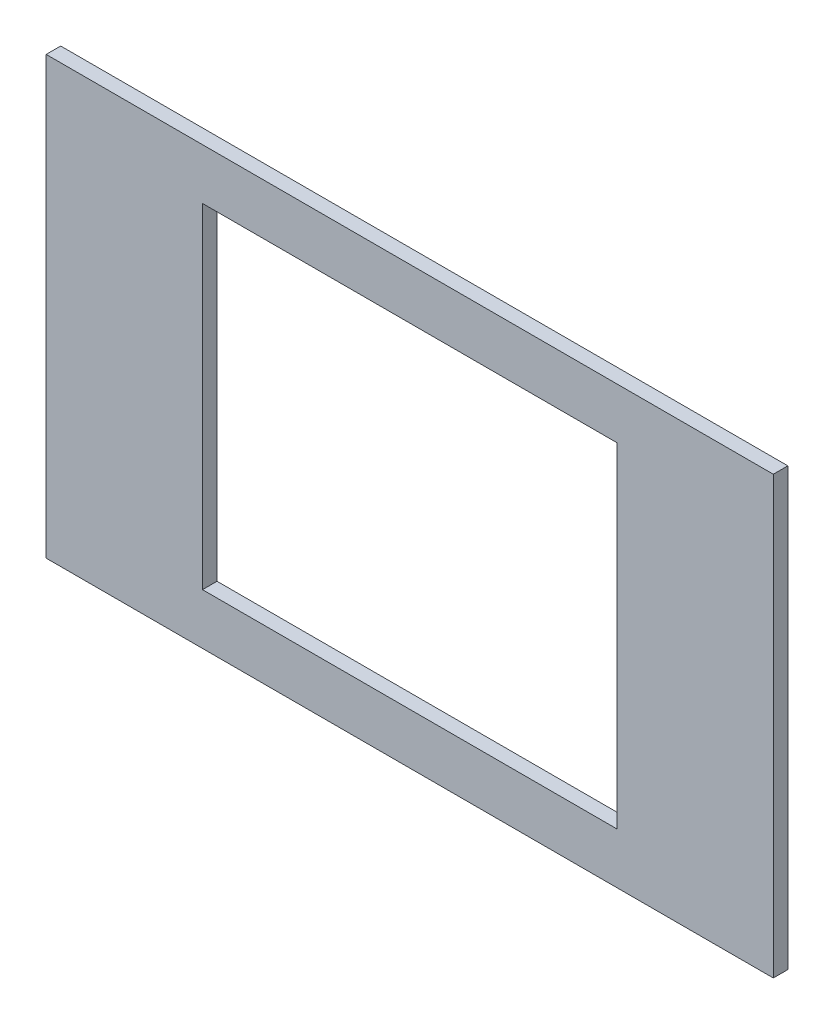
ISO-10303-21;
HEADER;
FILE_DESCRIPTION(('STEP AP214'),'2;1');
FILE_NAME('part.step','',(''),(''),'','','');
FILE_SCHEMA(('AUTOMOTIVE_DESIGN { 1 0 10303 214 1 1 1 1 }'));
ENDSEC;
DATA;
#1=APPLICATION_CONTEXT('core data for automotive mechanical design processes');
#2=APPLICATION_PROTOCOL_DEFINITION('international standard','automotive_design',2000,#1);
#3=PRODUCT_CONTEXT('',#1,'mechanical');
#4=PRODUCT('Part','Part','',(#3));
#5=PRODUCT_RELATED_PRODUCT_CATEGORY('part','',(#4));
#6=PRODUCT_DEFINITION_FORMATION('','',#4);
#7=PRODUCT_DEFINITION_CONTEXT('part definition',#1,'design');
#8=PRODUCT_DEFINITION('design','',#6,#7);
#9=PRODUCT_DEFINITION_SHAPE('','',#8);
#10=(LENGTH_UNIT() NAMED_UNIT(*) SI_UNIT(.MILLI.,.METRE.));
#11=(NAMED_UNIT(*) PLANE_ANGLE_UNIT() SI_UNIT($,.RADIAN.));
#12=(NAMED_UNIT(*) SI_UNIT($,.STERADIAN.) SOLID_ANGLE_UNIT());
#13=UNCERTAINTY_MEASURE_WITH_UNIT(LENGTH_MEASURE(1.E-05),#10,'distance_accuracy_value','');
#14=(GEOMETRIC_REPRESENTATION_CONTEXT(3) GLOBAL_UNCERTAINTY_ASSIGNED_CONTEXT((#13)) GLOBAL_UNIT_ASSIGNED_CONTEXT((#10,
#11,#12)) REPRESENTATION_CONTEXT('',''));
#15=CARTESIAN_POINT('',(0.,0.,0.));
#16=DIRECTION('',(0.,0.,1.));
#17=DIRECTION('',(1.,0.,0.));
#18=AXIS2_PLACEMENT_3D('',#15,#16,#17);
#19=CARTESIAN_POINT('',(63.5000000000001,-38.1,2.54));
#20=DIRECTION('',(-1.,0.,0.));
#21=DIRECTION('',(0.,0.,1.));
#22=AXIS2_PLACEMENT_3D('',#19,#20,#21);
#23=PLANE('',#22);
#24=DIRECTION('',(0.,1.,0.));
#25=VECTOR('',#24,1.);
#26=CARTESIAN_POINT('',(63.5000000000001,-38.1,0.));
#27=LINE('',#26,#25);
#28=CARTESIAN_POINT('',(63.5000000000001,-38.1,0.));
#29=VERTEX_POINT('',#28);
#30=CARTESIAN_POINT('',(63.5000000000001,38.1,0.));
#31=VERTEX_POINT('',#30);
#32=EDGE_CURVE('E130',#29,#31,#27,.T.);
#33=ORIENTED_EDGE('',*,*,#32,.T.);
#34=DIRECTION('',(0.,0.,-1.));
#35=VECTOR('',#34,1.);
#36=CARTESIAN_POINT('',(63.5000000000001,38.1,2.54));
#37=LINE('',#36,#35);
#38=CARTESIAN_POINT('',(63.5000000000001,38.1,2.54));
#39=VERTEX_POINT('',#38);
#40=EDGE_CURVE('E11',#39,#31,#37,.T.);
#41=ORIENTED_EDGE('',*,*,#40,.F.);
#42=DIRECTION('',(0.,1.,0.));
#43=VECTOR('',#42,1.);
#44=CARTESIAN_POINT('',(63.5000000000001,-38.1,2.54));
#45=LINE('',#44,#43);
#46=CARTESIAN_POINT('',(63.5000000000001,-38.1,2.54));
#47=VERTEX_POINT('',#46);
#48=EDGE_CURVE('E134',#47,#39,#45,.T.);
#49=ORIENTED_EDGE('',*,*,#48,.F.);
#50=DIRECTION('',(0.,0.,-1.));
#51=VECTOR('',#50,1.);
#52=CARTESIAN_POINT('',(63.5000000000001,-38.1,2.54));
#53=LINE('',#52,#51);
#54=EDGE_CURVE('E144',#47,#29,#53,.T.);
#55=ORIENTED_EDGE('',*,*,#54,.T.);
#56=EDGE_LOOP('',(#33,#41,#49,#55));
#57=FACE_BOUND('',#56,.T.);
#58=ADVANCED_FACE('F33',(#57),#23,.F.);
#59=CARTESIAN_POINT('',(-63.5,38.1,2.54));
#60=DIRECTION('',(0.,-1.,0.));
#61=DIRECTION('',(0.,0.,-1.));
#62=AXIS2_PLACEMENT_3D('',#59,#60,#61);
#63=PLANE('',#62);
#64=DIRECTION('',(-1.,0.,0.));
#65=VECTOR('',#64,1.);
#66=CARTESIAN_POINT('',(-63.5,38.1,0.));
#67=LINE('',#66,#65);
#68=CARTESIAN_POINT('',(-63.5,38.1,0.));
#69=VERTEX_POINT('',#68);
#70=EDGE_CURVE('E147',#31,#69,#67,.T.);
#71=ORIENTED_EDGE('',*,*,#70,.T.);
#72=DIRECTION('',(0.,0.,-1.));
#73=VECTOR('',#72,1.);
#74=CARTESIAN_POINT('',(-63.5,38.1,2.54));
#75=LINE('',#74,#73);
#76=CARTESIAN_POINT('',(-63.5,38.1,2.54));
#77=VERTEX_POINT('',#76);
#78=EDGE_CURVE('E40',#77,#69,#75,.T.);
#79=ORIENTED_EDGE('',*,*,#78,.F.);
#80=DIRECTION('',(-1.,0.,0.));
#81=VECTOR('',#80,1.);
#82=CARTESIAN_POINT('',(-63.5,38.1,2.54));
#83=LINE('',#82,#81);
#84=EDGE_CURVE('E137',#39,#77,#83,.T.);
#85=ORIENTED_EDGE('',*,*,#84,.F.);
#86=ORIENTED_EDGE('',*,*,#40,.T.);
#87=EDGE_LOOP('',(#71,#79,#85,#86));
#88=FACE_BOUND('',#87,.T.);
#89=ADVANCED_FACE('F175',(#88),#63,.F.);
#90=CARTESIAN_POINT('',(-63.5,-38.1,2.54));
#91=DIRECTION('',(1.,0.,0.));
#92=DIRECTION('',(0.,0.,-1.));
#93=AXIS2_PLACEMENT_3D('',#90,#91,#92);
#94=PLANE('',#93);
#95=DIRECTION('',(0.,-1.,0.));
#96=VECTOR('',#95,1.);
#97=CARTESIAN_POINT('',(-63.5,-38.1,0.));
#98=LINE('',#97,#96);
#99=CARTESIAN_POINT('',(-63.5,-38.1,0.));
#100=VERTEX_POINT('',#99);
#101=EDGE_CURVE('E149',#69,#100,#98,.T.);
#102=ORIENTED_EDGE('',*,*,#101,.T.);
#103=DIRECTION('',(0.,0.,-1.));
#104=VECTOR('',#103,1.);
#105=CARTESIAN_POINT('',(-63.5,-38.1,2.54));
#106=LINE('',#105,#104);
#107=CARTESIAN_POINT('',(-63.5,-38.1,2.54));
#108=VERTEX_POINT('',#107);
#109=EDGE_CURVE('E154',#108,#100,#106,.T.);
#110=ORIENTED_EDGE('',*,*,#109,.F.);
#111=DIRECTION('',(0.,-1.,0.));
#112=VECTOR('',#111,1.);
#113=CARTESIAN_POINT('',(-63.5,-38.1,2.54));
#114=LINE('',#113,#112);
#115=EDGE_CURVE('E140',#77,#108,#114,.T.);
#116=ORIENTED_EDGE('',*,*,#115,.F.);
#117=ORIENTED_EDGE('',*,*,#78,.T.);
#118=EDGE_LOOP('',(#102,#110,#116,#117));
#119=FACE_BOUND('',#118,.T.);
#120=ADVANCED_FACE('F161',(#119),#94,.F.);
#121=CARTESIAN_POINT('',(-63.5,-38.1,2.54));
#122=DIRECTION('',(0.,1.,0.));
#123=DIRECTION('',(0.,0.,1.));
#124=AXIS2_PLACEMENT_3D('',#121,#122,#123);
#125=PLANE('',#124);
#126=DIRECTION('',(1.,0.,0.));
#127=VECTOR('',#126,1.);
#128=CARTESIAN_POINT('',(-63.5,-38.1,0.));
#129=LINE('',#128,#127);
#130=EDGE_CURVE('E138',#100,#29,#129,.T.);
#131=ORIENTED_EDGE('',*,*,#130,.T.);
#132=ORIENTED_EDGE('',*,*,#54,.F.);
#133=DIRECTION('',(1.,0.,0.));
#134=VECTOR('',#133,1.);
#135=CARTESIAN_POINT('',(-63.5,-38.1,2.54));
#136=LINE('',#135,#134);
#137=EDGE_CURVE('E142',#108,#47,#136,.T.);
#138=ORIENTED_EDGE('',*,*,#137,.F.);
#139=ORIENTED_EDGE('',*,*,#109,.T.);
#140=EDGE_LOOP('',(#131,#132,#138,#139));
#141=FACE_BOUND('',#140,.T.);
#142=ADVANCED_FACE('F168',(#141),#125,.F.);
#143=CARTESIAN_POINT('',(0.,0.,2.54));
#144=DIRECTION('',(0.,0.,-1.));
#145=DIRECTION('',(-1.,0.,0.));
#146=AXIS2_PLACEMENT_3D('',#143,#144,#145);
#147=PLANE('',#146);
#148=DIRECTION('',(-1.,0.,0.));
#149=VECTOR('',#148,1.);
#150=CARTESIAN_POINT('',(-36.195,29.21,2.54));
#151=LINE('',#150,#149);
#152=CARTESIAN_POINT('',(36.195,29.21,2.54));
#153=VERTEX_POINT('',#152);
#154=CARTESIAN_POINT('',(-36.195,29.21,2.54));
#155=VERTEX_POINT('',#154);
#156=EDGE_CURVE('E124',#153,#155,#151,.T.);
#157=ORIENTED_EDGE('',*,*,#156,.F.);
#158=DIRECTION('',(0.,1.,0.));
#159=VECTOR('',#158,1.);
#160=CARTESIAN_POINT('',(36.195,-29.21,2.54));
#161=LINE('',#160,#159);
#162=CARTESIAN_POINT('',(36.195,-29.21,2.54));
#163=VERTEX_POINT('',#162);
#164=EDGE_CURVE('E47',#163,#153,#161,.T.);
#165=ORIENTED_EDGE('',*,*,#164,.F.);
#166=DIRECTION('',(1.,0.,0.));
#167=VECTOR('',#166,1.);
#168=CARTESIAN_POINT('',(-36.195,-29.21,2.54));
#169=LINE('',#168,#167);
#170=CARTESIAN_POINT('',(-36.195,-29.21,2.54));
#171=VERTEX_POINT('',#170);
#172=EDGE_CURVE('E115',#171,#163,#169,.T.);
#173=ORIENTED_EDGE('',*,*,#172,.F.);
#174=DIRECTION('',(0.,-1.,0.));
#175=VECTOR('',#174,1.);
#176=CARTESIAN_POINT('',(-36.195,-29.21,2.54));
#177=LINE('',#176,#175);
#178=EDGE_CURVE('E118',#155,#171,#177,.T.);
#179=ORIENTED_EDGE('',*,*,#178,.F.);
#180=EDGE_LOOP('',(#157,#165,#173,#179));
#181=FACE_BOUND('',#180,.T.);
#182=ORIENTED_EDGE('',*,*,#48,.T.);
#183=ORIENTED_EDGE('',*,*,#84,.T.);
#184=ORIENTED_EDGE('',*,*,#115,.T.);
#185=ORIENTED_EDGE('',*,*,#137,.T.);
#186=EDGE_LOOP('',(#182,#183,#184,#185));
#187=FACE_BOUND('',#186,.T.);
#188=ADVANCED_FACE('F174',(#181,#187),#147,.F.);
#189=CARTESIAN_POINT('',(0.,0.,0.));
#190=DIRECTION('',(0.,0.,-1.));
#191=DIRECTION('',(-1.,0.,0.));
#192=AXIS2_PLACEMENT_3D('',#189,#190,#191);
#193=PLANE('',#192);
#194=DIRECTION('',(0.,1.,0.));
#195=VECTOR('',#194,1.);
#196=CARTESIAN_POINT('',(36.195,-29.21,0.));
#197=LINE('',#196,#195);
#198=CARTESIAN_POINT('',(36.195,-29.21,0.));
#199=VERTEX_POINT('',#198);
#200=CARTESIAN_POINT('',(36.195,29.21,0.));
#201=VERTEX_POINT('',#200);
#202=EDGE_CURVE('E99',#199,#201,#197,.T.);
#203=ORIENTED_EDGE('',*,*,#202,.T.);
#204=DIRECTION('',(-1.,0.,0.));
#205=VECTOR('',#204,1.);
#206=CARTESIAN_POINT('',(-36.195,29.21,0.));
#207=LINE('',#206,#205);
#208=CARTESIAN_POINT('',(-36.195,29.21,0.));
#209=VERTEX_POINT('',#208);
#210=EDGE_CURVE('E108',#201,#209,#207,.T.);
#211=ORIENTED_EDGE('',*,*,#210,.T.);
#212=DIRECTION('',(0.,-1.,0.));
#213=VECTOR('',#212,1.);
#214=CARTESIAN_POINT('',(-36.195,-29.21,0.));
#215=LINE('',#214,#213);
#216=CARTESIAN_POINT('',(-36.195,-29.21,0.));
#217=VERTEX_POINT('',#216);
#218=EDGE_CURVE('E55',#209,#217,#215,.T.);
#219=ORIENTED_EDGE('',*,*,#218,.T.);
#220=DIRECTION('',(1.,0.,0.));
#221=VECTOR('',#220,1.);
#222=CARTESIAN_POINT('',(-36.195,-29.21,0.));
#223=LINE('',#222,#221);
#224=EDGE_CURVE('E105',#217,#199,#223,.T.);
#225=ORIENTED_EDGE('',*,*,#224,.T.);
#226=EDGE_LOOP('',(#203,#211,#219,#225));
#227=FACE_BOUND('',#226,.T.);
#228=ORIENTED_EDGE('',*,*,#32,.F.);
#229=ORIENTED_EDGE('',*,*,#130,.F.);
#230=ORIENTED_EDGE('',*,*,#101,.F.);
#231=ORIENTED_EDGE('',*,*,#70,.F.);
#232=EDGE_LOOP('',(#228,#229,#230,#231));
#233=FACE_BOUND('',#232,.T.);
#234=ADVANCED_FACE('F112',(#227,#233),#193,.T.);
#235=CARTESIAN_POINT('',(36.195,-29.21,0.));
#236=DIRECTION('',(1.,0.,0.));
#237=DIRECTION('',(0.,0.,-1.));
#238=AXIS2_PLACEMENT_3D('',#235,#236,#237);
#239=PLANE('',#238);
#240=ORIENTED_EDGE('',*,*,#164,.T.);
#241=DIRECTION('',(0.,0.,1.));
#242=VECTOR('',#241,1.);
#243=CARTESIAN_POINT('',(36.195,29.21,0.));
#244=LINE('',#243,#242);
#245=EDGE_CURVE('E95',#201,#153,#244,.T.);
#246=ORIENTED_EDGE('',*,*,#245,.F.);
#247=ORIENTED_EDGE('',*,*,#202,.F.);
#248=DIRECTION('',(0.,0.,1.));
#249=VECTOR('',#248,1.);
#250=CARTESIAN_POINT('',(36.195,-29.21,0.));
#251=LINE('',#250,#249);
#252=EDGE_CURVE('E128',#199,#163,#251,.T.);
#253=ORIENTED_EDGE('',*,*,#252,.T.);
#254=EDGE_LOOP('',(#240,#246,#247,#253));
#255=FACE_BOUND('',#254,.T.);
#256=ADVANCED_FACE('F97',(#255),#239,.F.);
#257=CARTESIAN_POINT('',(-36.195,-29.21,0.));
#258=DIRECTION('',(0.,-1.,0.));
#259=DIRECTION('',(0.,0.,-1.));
#260=AXIS2_PLACEMENT_3D('',#257,#258,#259);
#261=PLANE('',#260);
#262=ORIENTED_EDGE('',*,*,#172,.T.);
#263=ORIENTED_EDGE('',*,*,#252,.F.);
#264=ORIENTED_EDGE('',*,*,#224,.F.);
#265=DIRECTION('',(0.,0.,1.));
#266=VECTOR('',#265,1.);
#267=CARTESIAN_POINT('',(-36.195,-29.21,0.));
#268=LINE('',#267,#266);
#269=EDGE_CURVE('E131',#217,#171,#268,.T.);
#270=ORIENTED_EDGE('',*,*,#269,.T.);
#271=EDGE_LOOP('',(#262,#263,#264,#270));
#272=FACE_BOUND('',#271,.T.);
#273=ADVANCED_FACE('F192',(#272),#261,.F.);
#274=CARTESIAN_POINT('',(-36.195,-29.21,0.));
#275=DIRECTION('',(-1.,0.,0.));
#276=DIRECTION('',(0.,0.,1.));
#277=AXIS2_PLACEMENT_3D('',#274,#275,#276);
#278=PLANE('',#277);
#279=ORIENTED_EDGE('',*,*,#178,.T.);
#280=ORIENTED_EDGE('',*,*,#269,.F.);
#281=ORIENTED_EDGE('',*,*,#218,.F.);
#282=DIRECTION('',(0.,0.,1.));
#283=VECTOR('',#282,1.);
#284=CARTESIAN_POINT('',(-36.195,29.21,0.));
#285=LINE('',#284,#283);
#286=EDGE_CURVE('E104',#209,#155,#285,.T.);
#287=ORIENTED_EDGE('',*,*,#286,.T.);
#288=EDGE_LOOP('',(#279,#280,#281,#287));
#289=FACE_BOUND('',#288,.T.);
#290=ADVANCED_FACE('F195',(#289),#278,.F.);
#291=CARTESIAN_POINT('',(-36.195,29.21,0.));
#292=DIRECTION('',(0.,1.,0.));
#293=DIRECTION('',(0.,0.,1.));
#294=AXIS2_PLACEMENT_3D('',#291,#292,#293);
#295=PLANE('',#294);
#296=ORIENTED_EDGE('',*,*,#156,.T.);
#297=ORIENTED_EDGE('',*,*,#286,.F.);
#298=ORIENTED_EDGE('',*,*,#210,.F.);
#299=ORIENTED_EDGE('',*,*,#245,.T.);
#300=EDGE_LOOP('',(#296,#297,#298,#299));
#301=FACE_BOUND('',#300,.T.);
#302=ADVANCED_FACE('F109',(#301),#295,.F.);
#303=CLOSED_SHELL('',(#58,#89,#120,#142,#188,#234,#256,#273,#290,#302));
#304=MANIFOLD_SOLID_BREP('B2',#303);
#305=ADVANCED_BREP_SHAPE_REPRESENTATION('',(#18,#304),#14);
#306=SHAPE_DEFINITION_REPRESENTATION(#9,#305);
ENDSEC;
END-ISO-10303-21;
